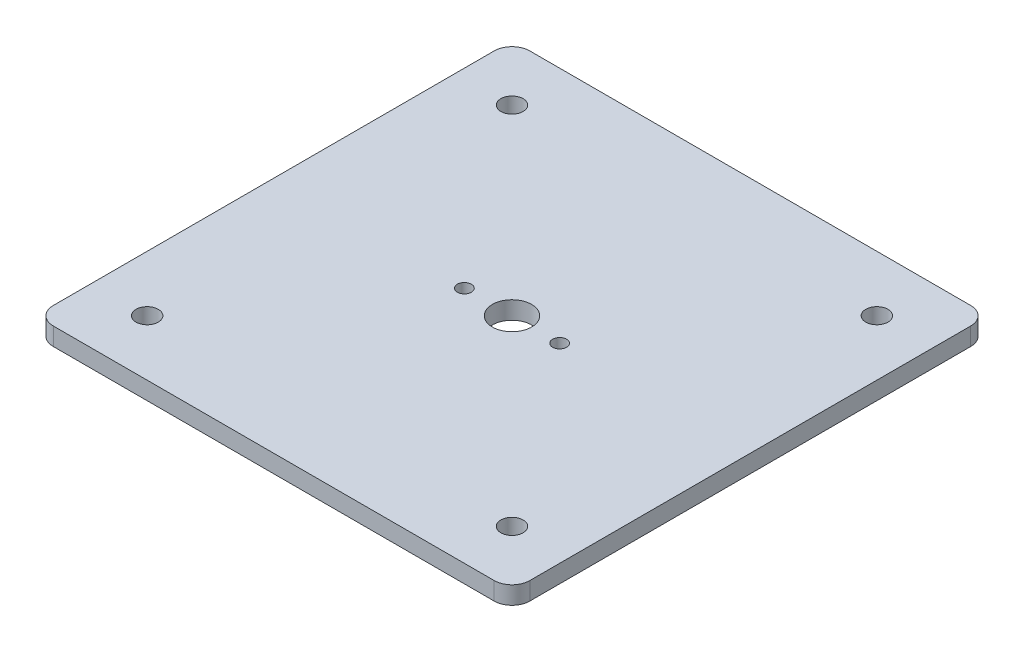
ISO-10303-21;
HEADER;
FILE_DESCRIPTION(('STEP AP214'),'2;1');
FILE_NAME('part.step','',(''),(''),'','','');
FILE_SCHEMA(('AUTOMOTIVE_DESIGN { 1 0 10303 214 1 1 1 1 }'));
ENDSEC;
DATA;
#1=APPLICATION_CONTEXT('core data for automotive mechanical design processes');
#2=APPLICATION_PROTOCOL_DEFINITION('international standard','automotive_design',2000,#1);
#3=PRODUCT_CONTEXT('',#1,'mechanical');
#4=PRODUCT('Part','Part','',(#3));
#5=PRODUCT_RELATED_PRODUCT_CATEGORY('part','',(#4));
#6=PRODUCT_DEFINITION_FORMATION('','',#4);
#7=PRODUCT_DEFINITION_CONTEXT('part definition',#1,'design');
#8=PRODUCT_DEFINITION('design','',#6,#7);
#9=PRODUCT_DEFINITION_SHAPE('','',#8);
#10=(LENGTH_UNIT() NAMED_UNIT(*) SI_UNIT(.MILLI.,.METRE.));
#11=(NAMED_UNIT(*) PLANE_ANGLE_UNIT() SI_UNIT($,.RADIAN.));
#12=(NAMED_UNIT(*) SI_UNIT($,.STERADIAN.) SOLID_ANGLE_UNIT());
#13=UNCERTAINTY_MEASURE_WITH_UNIT(LENGTH_MEASURE(1.E-05),#10,'distance_accuracy_value','');
#14=(GEOMETRIC_REPRESENTATION_CONTEXT(3) GLOBAL_UNCERTAINTY_ASSIGNED_CONTEXT((#13)) GLOBAL_UNIT_ASSIGNED_CONTEXT((#10,
#11,#12)) REPRESENTATION_CONTEXT('',''));
#15=CARTESIAN_POINT('',(0.,0.,0.));
#16=DIRECTION('',(0.,0.,1.));
#17=DIRECTION('',(1.,0.,0.));
#18=AXIS2_PLACEMENT_3D('',#15,#16,#17);
#19=CARTESIAN_POINT('',(75.045,0.,-9.95499999999999));
#20=DIRECTION('',(0.,1.,0.));
#21=DIRECTION('',(0.,0.,1.));
#22=AXIS2_PLACEMENT_3D('',#19,#20,#21);
#23=CYLINDRICAL_SURFACE('',#22,1.98500000000001);
#24=CARTESIAN_POINT('',(75.045,0.,-9.95499999999999));
#25=DIRECTION('',(0.,1.,0.));
#26=DIRECTION('',(0.,0.,1.));
#27=AXIS2_PLACEMENT_3D('',#24,#25,#26);
#28=CIRCLE('',#27,1.98500000000001);
#29=CARTESIAN_POINT('',(75.045,0.,-7.96999999999998));
#30=VERTEX_POINT('',#29);
#31=EDGE_CURVE('E165',#30,#30,#28,.T.);
#32=ORIENTED_EDGE('',*,*,#31,.F.);
#33=EDGE_LOOP('',(#32));
#34=FACE_BOUND('',#33,.T.);
#35=CARTESIAN_POINT('',(75.045,3.175,-9.95499999999999));
#36=DIRECTION('',(0.,1.,0.));
#37=DIRECTION('',(0.,0.,1.));
#38=AXIS2_PLACEMENT_3D('',#35,#36,#37);
#39=CIRCLE('',#38,1.98500000000001);
#40=CARTESIAN_POINT('',(75.045,3.175,-7.96999999999998));
#41=VERTEX_POINT('',#40);
#42=EDGE_CURVE('E169',#41,#41,#39,.T.);
#43=ORIENTED_EDGE('',*,*,#42,.T.);
#44=EDGE_LOOP('',(#43));
#45=FACE_BOUND('',#44,.T.);
#46=ADVANCED_FACE('F44',(#34,#45),#23,.F.);
#47=CARTESIAN_POINT('',(75.045,0.,-75.045));
#48=DIRECTION('',(0.,1.,0.));
#49=DIRECTION('',(0.,0.,1.));
#50=AXIS2_PLACEMENT_3D('',#47,#48,#49);
#51=CYLINDRICAL_SURFACE('',#50,1.98500000000001);
#52=CARTESIAN_POINT('',(75.045,0.,-75.045));
#53=DIRECTION('',(0.,1.,0.));
#54=DIRECTION('',(0.,0.,1.));
#55=AXIS2_PLACEMENT_3D('',#52,#53,#54);
#56=CIRCLE('',#55,1.98500000000001);
#57=CARTESIAN_POINT('',(75.045,0.,-73.06));
#58=VERTEX_POINT('',#57);
#59=EDGE_CURVE('E156',#58,#58,#56,.T.);
#60=ORIENTED_EDGE('',*,*,#59,.F.);
#61=EDGE_LOOP('',(#60));
#62=FACE_BOUND('',#61,.T.);
#63=CARTESIAN_POINT('',(75.045,3.175,-75.045));
#64=DIRECTION('',(0.,1.,0.));
#65=DIRECTION('',(0.,0.,1.));
#66=AXIS2_PLACEMENT_3D('',#63,#64,#65);
#67=CIRCLE('',#66,1.98500000000001);
#68=CARTESIAN_POINT('',(75.045,3.175,-73.06));
#69=VERTEX_POINT('',#68);
#70=EDGE_CURVE('E160',#69,#69,#67,.T.);
#71=ORIENTED_EDGE('',*,*,#70,.T.);
#72=EDGE_LOOP('',(#71));
#73=FACE_BOUND('',#72,.T.);
#74=ADVANCED_FACE('F276',(#62,#73),#51,.F.);
#75=CARTESIAN_POINT('',(0.,3.175,0.));
#76=DIRECTION('',(1.,0.,0.));
#77=DIRECTION('',(0.,0.,-1.));
#78=AXIS2_PLACEMENT_3D('',#75,#76,#77);
#79=PLANE('',#78);
#80=DIRECTION('',(0.,0.,1.));
#81=VECTOR('',#80,1.);
#82=CARTESIAN_POINT('',(0.,0.,0.));
#83=LINE('',#82,#81);
#84=CARTESIAN_POINT('',(0.,0.,-81.825));
#85=VERTEX_POINT('',#84);
#86=CARTESIAN_POINT('',(0.,0.,-3.175));
#87=VERTEX_POINT('',#86);
#88=EDGE_CURVE('E142',#85,#87,#83,.T.);
#89=ORIENTED_EDGE('',*,*,#88,.T.);
#90=DIRECTION('',(0.,-1.,0.));
#91=VECTOR('',#90,1.);
#92=CARTESIAN_POINT('',(0.,3.175,-3.175));
#93=LINE('',#92,#91);
#94=CARTESIAN_POINT('',(0.,3.175,-3.175));
#95=VERTEX_POINT('',#94);
#96=EDGE_CURVE('E116',#87,#95,#93,.F.);
#97=ORIENTED_EDGE('',*,*,#96,.T.);
#98=DIRECTION('',(0.,0.,1.));
#99=VECTOR('',#98,1.);
#100=CARTESIAN_POINT('',(0.,3.175,0.));
#101=LINE('',#100,#99);
#102=CARTESIAN_POINT('',(0.,3.175,-81.825));
#103=VERTEX_POINT('',#102);
#104=EDGE_CURVE('E155',#103,#95,#101,.T.);
#105=ORIENTED_EDGE('',*,*,#104,.F.);
#106=DIRECTION('',(0.,-1.,0.));
#107=VECTOR('',#106,1.);
#108=CARTESIAN_POINT('',(0.,3.175,-81.825));
#109=LINE('',#108,#107);
#110=EDGE_CURVE('E122',#103,#85,#109,.T.);
#111=ORIENTED_EDGE('',*,*,#110,.T.);
#112=EDGE_LOOP('',(#89,#97,#105,#111));
#113=FACE_BOUND('',#112,.T.);
#114=ADVANCED_FACE('F282',(#113),#79,.F.);
#115=CARTESIAN_POINT('',(0.,3.175,0.));
#116=DIRECTION('',(0.,0.,-1.));
#117=DIRECTION('',(-1.,0.,0.));
#118=AXIS2_PLACEMENT_3D('',#115,#116,#117);
#119=PLANE('',#118);
#120=DIRECTION('',(1.,0.,0.));
#121=VECTOR('',#120,1.);
#122=CARTESIAN_POINT('',(0.,3.175,0.));
#123=LINE('',#122,#121);
#124=CARTESIAN_POINT('',(3.175,3.175,0.));
#125=VERTEX_POINT('',#124);
#126=CARTESIAN_POINT('',(81.825,3.175,0.));
#127=VERTEX_POINT('',#126);
#128=EDGE_CURVE('E132',#125,#127,#123,.T.);
#129=ORIENTED_EDGE('',*,*,#128,.F.);
#130=DIRECTION('',(0.,-1.,0.));
#131=VECTOR('',#130,1.);
#132=CARTESIAN_POINT('',(3.175,3.175,0.));
#133=LINE('',#132,#131);
#134=CARTESIAN_POINT('',(3.175,0.,0.));
#135=VERTEX_POINT('',#134);
#136=EDGE_CURVE('E115',#125,#135,#133,.T.);
#137=ORIENTED_EDGE('',*,*,#136,.T.);
#138=DIRECTION('',(1.,0.,0.));
#139=VECTOR('',#138,1.);
#140=CARTESIAN_POINT('',(0.,0.,0.));
#141=LINE('',#140,#139);
#142=CARTESIAN_POINT('',(81.825,0.,0.));
#143=VERTEX_POINT('',#142);
#144=EDGE_CURVE('E129',#135,#143,#141,.T.);
#145=ORIENTED_EDGE('',*,*,#144,.T.);
#146=DIRECTION('',(0.,-1.,0.));
#147=VECTOR('',#146,1.);
#148=CARTESIAN_POINT('',(81.825,3.175,0.));
#149=LINE('',#148,#147);
#150=EDGE_CURVE('E135',#143,#127,#149,.F.);
#151=ORIENTED_EDGE('',*,*,#150,.T.);
#152=EDGE_LOOP('',(#129,#137,#145,#151));
#153=FACE_BOUND('',#152,.T.);
#154=ADVANCED_FACE('F128',(#153),#119,.F.);
#155=CARTESIAN_POINT('',(85.,3.175,0.));
#156=DIRECTION('',(-1.,0.,0.));
#157=DIRECTION('',(0.,0.,1.));
#158=AXIS2_PLACEMENT_3D('',#155,#156,#157);
#159=PLANE('',#158);
#160=DIRECTION('',(0.,0.,-1.));
#161=VECTOR('',#160,1.);
#162=CARTESIAN_POINT('',(85.,3.175,0.));
#163=LINE('',#162,#161);
#164=CARTESIAN_POINT('',(85.,3.175,-3.175));
#165=VERTEX_POINT('',#164);
#166=CARTESIAN_POINT('',(85.,3.175,-81.825));
#167=VERTEX_POINT('',#166);
#168=EDGE_CURVE('E207',#165,#167,#163,.T.);
#169=ORIENTED_EDGE('',*,*,#168,.F.);
#170=DIRECTION('',(0.,-1.,0.));
#171=VECTOR('',#170,1.);
#172=CARTESIAN_POINT('',(85.,3.175,-3.175));
#173=LINE('',#172,#171);
#174=CARTESIAN_POINT('',(85.,0.,-3.175));
#175=VERTEX_POINT('',#174);
#176=EDGE_CURVE('E201',#165,#175,#173,.T.);
#177=ORIENTED_EDGE('',*,*,#176,.T.);
#178=DIRECTION('',(0.,0.,-1.));
#179=VECTOR('',#178,1.);
#180=CARTESIAN_POINT('',(85.,0.,0.));
#181=LINE('',#180,#179);
#182=CARTESIAN_POINT('',(85.,0.,-81.825));
#183=VERTEX_POINT('',#182);
#184=EDGE_CURVE('E141',#175,#183,#181,.T.);
#185=ORIENTED_EDGE('',*,*,#184,.T.);
#186=DIRECTION('',(0.,-1.,0.));
#187=VECTOR('',#186,1.);
#188=CARTESIAN_POINT('',(85.,3.175,-81.825));
#189=LINE('',#188,#187);
#190=EDGE_CURVE('E198',#183,#167,#189,.F.);
#191=ORIENTED_EDGE('',*,*,#190,.T.);
#192=EDGE_LOOP('',(#169,#177,#185,#191));
#193=FACE_BOUND('',#192,.T.);
#194=ADVANCED_FACE('F312',(#193),#159,.F.);
#195=CARTESIAN_POINT('',(0.,3.175,-85.));
#196=DIRECTION('',(0.,0.,1.));
#197=DIRECTION('',(1.,0.,0.));
#198=AXIS2_PLACEMENT_3D('',#195,#196,#197);
#199=PLANE('',#198);
#200=DIRECTION('',(-1.,0.,0.));
#201=VECTOR('',#200,1.);
#202=CARTESIAN_POINT('',(0.,3.175,-85.));
#203=LINE('',#202,#201);
#204=CARTESIAN_POINT('',(81.825,3.175,-85.));
#205=VERTEX_POINT('',#204);
#206=CARTESIAN_POINT('',(3.175,3.175,-85.));
#207=VERTEX_POINT('',#206);
#208=EDGE_CURVE('E161',#205,#207,#203,.T.);
#209=ORIENTED_EDGE('',*,*,#208,.F.);
#210=DIRECTION('',(0.,-1.,0.));
#211=VECTOR('',#210,1.);
#212=CARTESIAN_POINT('',(81.825,3.175,-85.));
#213=LINE('',#212,#211);
#214=CARTESIAN_POINT('',(81.825,0.,-85.));
#215=VERTEX_POINT('',#214);
#216=EDGE_CURVE('E11',#205,#215,#213,.T.);
#217=ORIENTED_EDGE('',*,*,#216,.T.);
#218=DIRECTION('',(-1.,0.,0.));
#219=VECTOR('',#218,1.);
#220=CARTESIAN_POINT('',(0.,0.,-85.));
#221=LINE('',#220,#219);
#222=CARTESIAN_POINT('',(3.175,0.,-85.));
#223=VERTEX_POINT('',#222);
#224=EDGE_CURVE('E147',#215,#223,#221,.T.);
#225=ORIENTED_EDGE('',*,*,#224,.T.);
#226=DIRECTION('',(0.,-1.,0.));
#227=VECTOR('',#226,1.);
#228=CARTESIAN_POINT('',(3.175,3.175,-85.));
#229=LINE('',#228,#227);
#230=EDGE_CURVE('E53',#223,#207,#229,.F.);
#231=ORIENTED_EDGE('',*,*,#230,.T.);
#232=EDGE_LOOP('',(#209,#217,#225,#231));
#233=FACE_BOUND('',#232,.T.);
#234=ADVANCED_FACE('F261',(#233),#199,.F.);
#235=CARTESIAN_POINT('',(0.,3.175,0.));
#236=DIRECTION('',(0.,-1.,0.));
#237=DIRECTION('',(0.,0.,-1.));
#238=AXIS2_PLACEMENT_3D('',#235,#236,#237);
#239=PLANE('',#238);
#240=CARTESIAN_POINT('',(34.,3.175,-42.5));
#241=DIRECTION('',(0.,1.,0.));
#242=DIRECTION('',(0.,0.,1.));
#243=AXIS2_PLACEMENT_3D('',#240,#241,#242);
#244=CIRCLE('',#243,1.24999999999999);
#245=CARTESIAN_POINT('',(34.,3.175,-41.25));
#246=VERTEX_POINT('',#245);
#247=EDGE_CURVE('E251',#246,#246,#244,.T.);
#248=ORIENTED_EDGE('',*,*,#247,.F.);
#249=EDGE_LOOP('',(#248));
#250=FACE_BOUND('',#249,.T.);
#251=CARTESIAN_POINT('',(51.,3.175,-42.5));
#252=DIRECTION('',(0.,1.,0.));
#253=DIRECTION('',(0.,0.,1.));
#254=AXIS2_PLACEMENT_3D('',#251,#252,#253);
#255=CIRCLE('',#254,1.24999999999999);
#256=CARTESIAN_POINT('',(51.,3.175,-41.25));
#257=VERTEX_POINT('',#256);
#258=EDGE_CURVE('E243',#257,#257,#255,.T.);
#259=ORIENTED_EDGE('',*,*,#258,.F.);
#260=EDGE_LOOP('',(#259));
#261=FACE_BOUND('',#260,.T.);
#262=CARTESIAN_POINT('',(42.5,3.175,-42.5));
#263=DIRECTION('',(0.,1.,0.));
#264=DIRECTION('',(0.,0.,1.));
#265=AXIS2_PLACEMENT_3D('',#262,#263,#264);
#266=CIRCLE('',#265,3.5);
#267=CARTESIAN_POINT('',(42.5,3.175,-39.));
#268=VERTEX_POINT('',#267);
#269=EDGE_CURVE('E232',#268,#268,#266,.T.);
#270=ORIENTED_EDGE('',*,*,#269,.F.);
#271=EDGE_LOOP('',(#270));
#272=FACE_BOUND('',#271,.T.);
#273=CARTESIAN_POINT('',(9.955,3.175,-9.95499999999999));
#274=DIRECTION('',(0.,1.,0.));
#275=DIRECTION('',(0.,0.,1.));
#276=AXIS2_PLACEMENT_3D('',#273,#274,#275);
#277=CIRCLE('',#276,1.98500000000001);
#278=CARTESIAN_POINT('',(9.955,3.175,-7.96999999999998));
#279=VERTEX_POINT('',#278);
#280=EDGE_CURVE('E220',#279,#279,#277,.T.);
#281=ORIENTED_EDGE('',*,*,#280,.F.);
#282=EDGE_LOOP('',(#281));
#283=FACE_BOUND('',#282,.T.);
#284=CARTESIAN_POINT('',(9.955,3.175,-75.045));
#285=DIRECTION('',(0.,1.,0.));
#286=DIRECTION('',(0.,0.,1.));
#287=AXIS2_PLACEMENT_3D('',#284,#285,#286);
#288=CIRCLE('',#287,1.98500000000001);
#289=CARTESIAN_POINT('',(9.955,3.175,-73.06));
#290=VERTEX_POINT('',#289);
#291=EDGE_CURVE('E216',#290,#290,#288,.T.);
#292=ORIENTED_EDGE('',*,*,#291,.F.);
#293=EDGE_LOOP('',(#292));
#294=FACE_BOUND('',#293,.T.);
#295=ORIENTED_EDGE('',*,*,#104,.T.);
#296=CARTESIAN_POINT('',(3.175,3.175,-3.175));
#297=DIRECTION('',(0.,-1.,0.));
#298=DIRECTION('',(0.,0.,-1.));
#299=AXIS2_PLACEMENT_3D('',#296,#297,#298);
#300=CIRCLE('',#299,3.175);
#301=EDGE_CURVE('E195',#95,#125,#300,.F.);
#302=ORIENTED_EDGE('',*,*,#301,.T.);
#303=ORIENTED_EDGE('',*,*,#128,.T.);
#304=CARTESIAN_POINT('',(81.825,3.175,-3.175));
#305=DIRECTION('',(0.,-1.,0.));
#306=DIRECTION('',(0.,0.,-1.));
#307=AXIS2_PLACEMENT_3D('',#304,#305,#306);
#308=CIRCLE('',#307,3.175);
#309=EDGE_CURVE('E192',#127,#165,#308,.F.);
#310=ORIENTED_EDGE('',*,*,#309,.T.);
#311=ORIENTED_EDGE('',*,*,#168,.T.);
#312=CARTESIAN_POINT('',(81.825,3.175,-81.825));
#313=DIRECTION('',(0.,-1.,0.));
#314=DIRECTION('',(0.,0.,-1.));
#315=AXIS2_PLACEMENT_3D('',#312,#313,#314);
#316=CIRCLE('',#315,3.175);
#317=EDGE_CURVE('E66',#167,#205,#316,.F.);
#318=ORIENTED_EDGE('',*,*,#317,.T.);
#319=ORIENTED_EDGE('',*,*,#208,.T.);
#320=CARTESIAN_POINT('',(3.175,3.175,-81.825));
#321=DIRECTION('',(0.,-1.,0.));
#322=DIRECTION('',(0.,0.,-1.));
#323=AXIS2_PLACEMENT_3D('',#320,#321,#322);
#324=CIRCLE('',#323,3.175);
#325=EDGE_CURVE('E187',#207,#103,#324,.F.);
#326=ORIENTED_EDGE('',*,*,#325,.T.);
#327=EDGE_LOOP('',(#295,#302,#303,#310,#311,#318,#319,#326));
#328=FACE_BOUND('',#327,.T.);
#329=ORIENTED_EDGE('',*,*,#70,.F.);
#330=EDGE_LOOP('',(#329));
#331=FACE_BOUND('',#330,.T.);
#332=ORIENTED_EDGE('',*,*,#42,.F.);
#333=EDGE_LOOP('',(#332));
#334=FACE_BOUND('',#333,.T.);
#335=ADVANCED_FACE('F258',(#250,#261,#272,#283,#294,#328,#331,#334),#239,.F.);
#336=CARTESIAN_POINT('',(0.,0.,0.));
#337=DIRECTION('',(0.,-1.,0.));
#338=DIRECTION('',(0.,0.,-1.));
#339=AXIS2_PLACEMENT_3D('',#336,#337,#338);
#340=PLANE('',#339);
#341=CARTESIAN_POINT('',(34.,0.,-42.5));
#342=DIRECTION('',(0.,1.,0.));
#343=DIRECTION('',(0.,0.,1.));
#344=AXIS2_PLACEMENT_3D('',#341,#342,#343);
#345=CIRCLE('',#344,1.25);
#346=CARTESIAN_POINT('',(34.,0.,-41.25));
#347=VERTEX_POINT('',#346);
#348=EDGE_CURVE('E247',#347,#347,#345,.T.);
#349=ORIENTED_EDGE('',*,*,#348,.T.);
#350=EDGE_LOOP('',(#349));
#351=FACE_BOUND('',#350,.T.);
#352=CARTESIAN_POINT('',(51.,0.,-42.5));
#353=DIRECTION('',(0.,1.,0.));
#354=DIRECTION('',(0.,0.,1.));
#355=AXIS2_PLACEMENT_3D('',#352,#353,#354);
#356=CIRCLE('',#355,1.25);
#357=CARTESIAN_POINT('',(51.,0.,-41.25));
#358=VERTEX_POINT('',#357);
#359=EDGE_CURVE('E236',#358,#358,#356,.T.);
#360=ORIENTED_EDGE('',*,*,#359,.T.);
#361=EDGE_LOOP('',(#360));
#362=FACE_BOUND('',#361,.T.);
#363=CARTESIAN_POINT('',(42.5,0.,-42.5));
#364=DIRECTION('',(0.,1.,0.));
#365=DIRECTION('',(0.,0.,1.));
#366=AXIS2_PLACEMENT_3D('',#363,#364,#365);
#367=CIRCLE('',#366,3.5);
#368=CARTESIAN_POINT('',(42.5,0.,-39.));
#369=VERTEX_POINT('',#368);
#370=EDGE_CURVE('E231',#369,#369,#367,.T.);
#371=ORIENTED_EDGE('',*,*,#370,.T.);
#372=EDGE_LOOP('',(#371));
#373=FACE_BOUND('',#372,.T.);
#374=CARTESIAN_POINT('',(9.955,0.,-9.95499999999999));
#375=DIRECTION('',(0.,1.,0.));
#376=DIRECTION('',(0.,0.,1.));
#377=AXIS2_PLACEMENT_3D('',#374,#375,#376);
#378=CIRCLE('',#377,1.98500000000001);
#379=CARTESIAN_POINT('',(9.955,0.,-7.96999999999998));
#380=VERTEX_POINT('',#379);
#381=EDGE_CURVE('E227',#380,#380,#378,.T.);
#382=ORIENTED_EDGE('',*,*,#381,.T.);
#383=EDGE_LOOP('',(#382));
#384=FACE_BOUND('',#383,.T.);
#385=CARTESIAN_POINT('',(9.955,0.,-75.045));
#386=DIRECTION('',(0.,1.,0.));
#387=DIRECTION('',(0.,0.,1.));
#388=AXIS2_PLACEMENT_3D('',#385,#386,#387);
#389=CIRCLE('',#388,1.98500000000001);
#390=CARTESIAN_POINT('',(9.955,0.,-73.06));
#391=VERTEX_POINT('',#390);
#392=EDGE_CURVE('E149',#391,#391,#389,.T.);
#393=ORIENTED_EDGE('',*,*,#392,.T.);
#394=EDGE_LOOP('',(#393));
#395=FACE_BOUND('',#394,.T.);
#396=ORIENTED_EDGE('',*,*,#144,.F.);
#397=CARTESIAN_POINT('',(3.175,0.,-3.175));
#398=DIRECTION('',(0.,-1.,0.));
#399=DIRECTION('',(0.,0.,-1.));
#400=AXIS2_PLACEMENT_3D('',#397,#398,#399);
#401=CIRCLE('',#400,3.175);
#402=EDGE_CURVE('E111',#135,#87,#401,.T.);
#403=ORIENTED_EDGE('',*,*,#402,.T.);
#404=ORIENTED_EDGE('',*,*,#88,.F.);
#405=CARTESIAN_POINT('',(3.175,0.,-81.825));
#406=DIRECTION('',(0.,-1.,0.));
#407=DIRECTION('',(0.,0.,-1.));
#408=AXIS2_PLACEMENT_3D('',#405,#406,#407);
#409=CIRCLE('',#408,3.175);
#410=EDGE_CURVE('E134',#85,#223,#409,.T.);
#411=ORIENTED_EDGE('',*,*,#410,.T.);
#412=ORIENTED_EDGE('',*,*,#224,.F.);
#413=CARTESIAN_POINT('',(81.825,0.,-81.825));
#414=DIRECTION('',(0.,-1.,0.));
#415=DIRECTION('',(0.,0.,-1.));
#416=AXIS2_PLACEMENT_3D('',#413,#414,#415);
#417=CIRCLE('',#416,3.175);
#418=EDGE_CURVE('E177',#215,#183,#417,.T.);
#419=ORIENTED_EDGE('',*,*,#418,.T.);
#420=ORIENTED_EDGE('',*,*,#184,.F.);
#421=CARTESIAN_POINT('',(81.825,0.,-3.175));
#422=DIRECTION('',(0.,-1.,0.));
#423=DIRECTION('',(0.,0.,-1.));
#424=AXIS2_PLACEMENT_3D('',#421,#422,#423);
#425=CIRCLE('',#424,3.175);
#426=EDGE_CURVE('E123',#175,#143,#425,.T.);
#427=ORIENTED_EDGE('',*,*,#426,.T.);
#428=EDGE_LOOP('',(#396,#403,#404,#411,#412,#419,#420,#427));
#429=FACE_BOUND('',#428,.T.);
#430=ORIENTED_EDGE('',*,*,#59,.T.);
#431=EDGE_LOOP('',(#430));
#432=FACE_BOUND('',#431,.T.);
#433=ORIENTED_EDGE('',*,*,#31,.T.);
#434=EDGE_LOOP('',(#433));
#435=FACE_BOUND('',#434,.T.);
#436=ADVANCED_FACE('F137',(#351,#362,#373,#384,#395,#429,#432,#435),#340,.T.);
#437=CARTESIAN_POINT('',(9.955,0.,-75.045));
#438=DIRECTION('',(0.,1.,0.));
#439=DIRECTION('',(0.,0.,1.));
#440=AXIS2_PLACEMENT_3D('',#437,#438,#439);
#441=CYLINDRICAL_SURFACE('',#440,1.98500000000001);
#442=ORIENTED_EDGE('',*,*,#392,.F.);
#443=EDGE_LOOP('',(#442));
#444=FACE_BOUND('',#443,.T.);
#445=ORIENTED_EDGE('',*,*,#291,.T.);
#446=EDGE_LOOP('',(#445));
#447=FACE_BOUND('',#446,.T.);
#448=ADVANCED_FACE('F321',(#444,#447),#441,.F.);
#449=CARTESIAN_POINT('',(9.955,0.,-9.95499999999999));
#450=DIRECTION('',(0.,1.,0.));
#451=DIRECTION('',(0.,0.,1.));
#452=AXIS2_PLACEMENT_3D('',#449,#450,#451);
#453=CYLINDRICAL_SURFACE('',#452,1.98500000000001);
#454=ORIENTED_EDGE('',*,*,#381,.F.);
#455=EDGE_LOOP('',(#454));
#456=FACE_BOUND('',#455,.T.);
#457=ORIENTED_EDGE('',*,*,#280,.T.);
#458=EDGE_LOOP('',(#457));
#459=FACE_BOUND('',#458,.T.);
#460=ADVANCED_FACE('F291',(#456,#459),#453,.F.);
#461=CARTESIAN_POINT('',(3.175,3.175,-3.175));
#462=DIRECTION('',(0.,-1.,0.));
#463=DIRECTION('',(0.,0.,-1.));
#464=AXIS2_PLACEMENT_3D('',#461,#462,#463);
#465=CYLINDRICAL_SURFACE('',#464,3.175);
#466=ORIENTED_EDGE('',*,*,#301,.F.);
#467=ORIENTED_EDGE('',*,*,#96,.F.);
#468=ORIENTED_EDGE('',*,*,#402,.F.);
#469=ORIENTED_EDGE('',*,*,#136,.F.);
#470=EDGE_LOOP('',(#466,#467,#468,#469));
#471=FACE_BOUND('',#470,.T.);
#472=ADVANCED_FACE('F114',(#471),#465,.T.);
#473=CARTESIAN_POINT('',(81.825,3.175,-3.175));
#474=DIRECTION('',(0.,-1.,0.));
#475=DIRECTION('',(0.,0.,-1.));
#476=AXIS2_PLACEMENT_3D('',#473,#474,#475);
#477=CYLINDRICAL_SURFACE('',#476,3.175);
#478=ORIENTED_EDGE('',*,*,#309,.F.);
#479=ORIENTED_EDGE('',*,*,#150,.F.);
#480=ORIENTED_EDGE('',*,*,#426,.F.);
#481=ORIENTED_EDGE('',*,*,#176,.F.);
#482=EDGE_LOOP('',(#478,#479,#480,#481));
#483=FACE_BOUND('',#482,.T.);
#484=ADVANCED_FACE('F290',(#483),#477,.T.);
#485=CARTESIAN_POINT('',(81.825,3.175,-81.825));
#486=DIRECTION('',(0.,-1.,0.));
#487=DIRECTION('',(0.,0.,-1.));
#488=AXIS2_PLACEMENT_3D('',#485,#486,#487);
#489=CYLINDRICAL_SURFACE('',#488,3.175);
#490=ORIENTED_EDGE('',*,*,#317,.F.);
#491=ORIENTED_EDGE('',*,*,#190,.F.);
#492=ORIENTED_EDGE('',*,*,#418,.F.);
#493=ORIENTED_EDGE('',*,*,#216,.F.);
#494=EDGE_LOOP('',(#490,#491,#492,#493));
#495=FACE_BOUND('',#494,.T.);
#496=ADVANCED_FACE('F293',(#495),#489,.T.);
#497=CARTESIAN_POINT('',(3.175,3.175,-81.825));
#498=DIRECTION('',(0.,-1.,0.));
#499=DIRECTION('',(0.,0.,-1.));
#500=AXIS2_PLACEMENT_3D('',#497,#498,#499);
#501=CYLINDRICAL_SURFACE('',#500,3.175);
#502=ORIENTED_EDGE('',*,*,#325,.F.);
#503=ORIENTED_EDGE('',*,*,#230,.F.);
#504=ORIENTED_EDGE('',*,*,#410,.F.);
#505=ORIENTED_EDGE('',*,*,#110,.F.);
#506=EDGE_LOOP('',(#502,#503,#504,#505));
#507=FACE_BOUND('',#506,.T.);
#508=ADVANCED_FACE('F46',(#507),#501,.T.);
#509=CARTESIAN_POINT('',(42.5,0.,-42.5));
#510=DIRECTION('',(0.,1.,0.));
#511=DIRECTION('',(0.,0.,1.));
#512=AXIS2_PLACEMENT_3D('',#509,#510,#511);
#513=CYLINDRICAL_SURFACE('',#512,3.5);
#514=ORIENTED_EDGE('',*,*,#370,.F.);
#515=EDGE_LOOP('',(#514));
#516=FACE_BOUND('',#515,.T.);
#517=ORIENTED_EDGE('',*,*,#269,.T.);
#518=EDGE_LOOP('',(#517));
#519=FACE_BOUND('',#518,.T.);
#520=ADVANCED_FACE('F300',(#516,#519),#513,.F.);
#521=CARTESIAN_POINT('',(51.,3.175,-42.5));
#522=DIRECTION('',(0.,1.,0.));
#523=DIRECTION('',(0.,0.,1.));
#524=AXIS2_PLACEMENT_3D('',#521,#522,#523);
#525=CYLINDRICAL_SURFACE('',#524,1.24999999999999);
#526=ORIENTED_EDGE('',*,*,#359,.F.);
#527=EDGE_LOOP('',(#526));
#528=FACE_BOUND('',#527,.T.);
#529=ORIENTED_EDGE('',*,*,#258,.T.);
#530=EDGE_LOOP('',(#529));
#531=FACE_BOUND('',#530,.T.);
#532=ADVANCED_FACE('F332',(#528,#531),#525,.F.);
#533=CARTESIAN_POINT('',(34.,3.175,-42.5));
#534=DIRECTION('',(0.,1.,0.));
#535=DIRECTION('',(0.,0.,1.));
#536=AXIS2_PLACEMENT_3D('',#533,#534,#535);
#537=CYLINDRICAL_SURFACE('',#536,1.24999999999999);
#538=ORIENTED_EDGE('',*,*,#348,.F.);
#539=EDGE_LOOP('',(#538));
#540=FACE_BOUND('',#539,.T.);
#541=ORIENTED_EDGE('',*,*,#247,.T.);
#542=EDGE_LOOP('',(#541));
#543=FACE_BOUND('',#542,.T.);
#544=ADVANCED_FACE('F256',(#540,#543),#537,.F.);
#545=CLOSED_SHELL('',(#46,#74,#114,#154,#194,#234,#335,#436,#448,#460,#472,#484,#496,#508,#520,
#532,#544));
#546=MANIFOLD_SOLID_BREP('B2',#545);
#547=ADVANCED_BREP_SHAPE_REPRESENTATION('',(#18,#546),#14);
#548=SHAPE_DEFINITION_REPRESENTATION(#9,#547);
ENDSEC;
END-ISO-10303-21;
